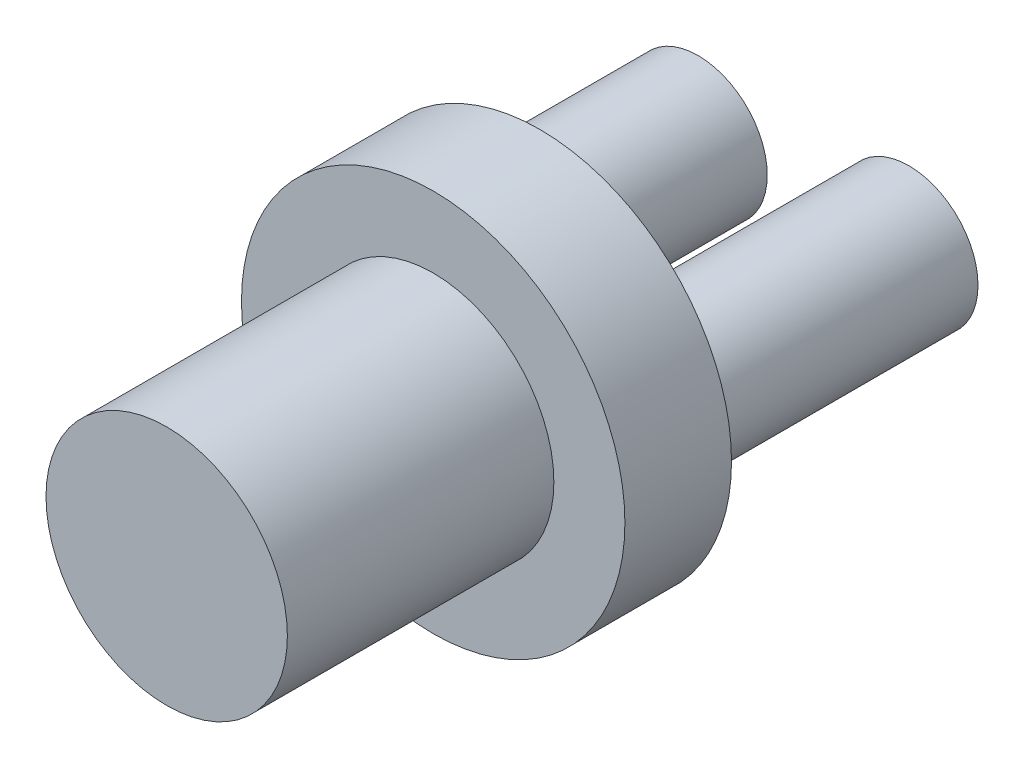
ISO-10303-21;
HEADER;
FILE_DESCRIPTION(('STEP AP214'),'2;1');
FILE_NAME('part.step','',(''),(''),'','','');
FILE_SCHEMA(('AUTOMOTIVE_DESIGN { 1 0 10303 214 1 1 1 1 }'));
ENDSEC;
DATA;
#1=APPLICATION_CONTEXT('core data for automotive mechanical design processes');
#2=APPLICATION_PROTOCOL_DEFINITION('international standard','automotive_design',2000,#1);
#3=PRODUCT_CONTEXT('',#1,'mechanical');
#4=PRODUCT('Part','Part','',(#3));
#5=PRODUCT_RELATED_PRODUCT_CATEGORY('part','',(#4));
#6=PRODUCT_DEFINITION_FORMATION('','',#4);
#7=PRODUCT_DEFINITION_CONTEXT('part definition',#1,'design');
#8=PRODUCT_DEFINITION('design','',#6,#7);
#9=PRODUCT_DEFINITION_SHAPE('','',#8);
#10=(LENGTH_UNIT() NAMED_UNIT(*) SI_UNIT(.MILLI.,.METRE.));
#11=(NAMED_UNIT(*) PLANE_ANGLE_UNIT() SI_UNIT($,.RADIAN.));
#12=(NAMED_UNIT(*) SI_UNIT($,.STERADIAN.) SOLID_ANGLE_UNIT());
#13=UNCERTAINTY_MEASURE_WITH_UNIT(LENGTH_MEASURE(1.E-05),#10,'distance_accuracy_value','');
#14=(GEOMETRIC_REPRESENTATION_CONTEXT(3) GLOBAL_UNCERTAINTY_ASSIGNED_CONTEXT((#13)) GLOBAL_UNIT_ASSIGNED_CONTEXT((#10,
#11,#12)) REPRESENTATION_CONTEXT('',''));
#15=CARTESIAN_POINT('',(0.,0.,0.));
#16=DIRECTION('',(0.,0.,1.));
#17=DIRECTION('',(1.,0.,0.));
#18=AXIS2_PLACEMENT_3D('',#15,#16,#17);
#19=CARTESIAN_POINT('',(0.,0.,20.));
#20=DIRECTION('',(0.,0.,-1.));
#21=DIRECTION('',(-1.,0.,0.));
#22=AXIS2_PLACEMENT_3D('',#19,#20,#21);
#23=CYLINDRICAL_SURFACE('',#22,35.97);
#24=CARTESIAN_POINT('',(0.,0.,20.));
#25=DIRECTION('',(0.,0.,1.));
#26=DIRECTION('',(1.,0.,0.));
#27=AXIS2_PLACEMENT_3D('',#24,#25,#26);
#28=CIRCLE('',#27,35.97);
#29=CARTESIAN_POINT('',(35.97,0.,20.));
#30=VERTEX_POINT('',#29);
#31=EDGE_CURVE('E44',#30,#30,#28,.T.);
#32=ORIENTED_EDGE('',*,*,#31,.F.);
#33=EDGE_LOOP('',(#32));
#34=FACE_BOUND('',#33,.T.);
#35=CARTESIAN_POINT('',(0.,0.,0.));
#36=DIRECTION('',(0.,0.,1.));
#37=DIRECTION('',(1.,0.,0.));
#38=AXIS2_PLACEMENT_3D('',#35,#36,#37);
#39=CIRCLE('',#38,35.97);
#40=CARTESIAN_POINT('',(35.97,0.,0.));
#41=VERTEX_POINT('',#40);
#42=EDGE_CURVE('E48',#41,#41,#39,.T.);
#43=ORIENTED_EDGE('',*,*,#42,.T.);
#44=EDGE_LOOP('',(#43));
#45=FACE_BOUND('',#44,.T.);
#46=ADVANCED_FACE('F34',(#34,#45),#23,.T.);
#47=CARTESIAN_POINT('',(0.,0.,20.));
#48=DIRECTION('',(0.,0.,1.));
#49=DIRECTION('',(1.,0.,0.));
#50=AXIS2_PLACEMENT_3D('',#47,#48,#49);
#51=PLANE('',#50);
#52=CARTESIAN_POINT('',(0.,0.,20.));
#53=DIRECTION('',(0.,0.,1.));
#54=DIRECTION('',(1.,0.,0.));
#55=AXIS2_PLACEMENT_3D('',#52,#53,#54);
#56=CIRCLE('',#55,22.6427431978425);
#57=CARTESIAN_POINT('',(22.6427431978425,0.,20.));
#58=VERTEX_POINT('',#57);
#59=EDGE_CURVE('E69',#58,#58,#56,.F.);
#60=ORIENTED_EDGE('',*,*,#59,.T.);
#61=EDGE_LOOP('',(#60));
#62=FACE_BOUND('',#61,.T.);
#63=ORIENTED_EDGE('',*,*,#31,.T.);
#64=EDGE_LOOP('',(#63));
#65=FACE_BOUND('',#64,.T.);
#66=ADVANCED_FACE('F95',(#62,#65),#51,.T.);
#67=CARTESIAN_POINT('',(0.,0.,0.));
#68=DIRECTION('',(0.,0.,1.));
#69=DIRECTION('',(1.,0.,0.));
#70=AXIS2_PLACEMENT_3D('',#67,#68,#69);
#71=PLANE('',#70);
#72=CARTESIAN_POINT('',(-20.2761617874865,-0.124861403939303,0.));
#73=DIRECTION('',(0.,0.,1.));
#74=DIRECTION('',(1.,0.,0.));
#75=AXIS2_PLACEMENT_3D('',#72,#73,#74);
#76=CIRCLE('',#75,12.95);
#77=CARTESIAN_POINT('',(-7.32616178748648,-0.124861403939303,0.));
#78=VERTEX_POINT('',#77);
#79=EDGE_CURVE('E10',#78,#78,#76,.F.);
#80=ORIENTED_EDGE('',*,*,#79,.F.);
#81=EDGE_LOOP('',(#80));
#82=FACE_BOUND('',#81,.T.);
#83=CARTESIAN_POINT('',(19.2685622101472,1.74925223466937,0.));
#84=DIRECTION('',(0.,0.,1.));
#85=DIRECTION('',(1.,0.,0.));
#86=AXIS2_PLACEMENT_3D('',#83,#84,#85);
#87=CIRCLE('',#86,12.9482187117196);
#88=CARTESIAN_POINT('',(32.2167809218668,1.74925223466937,0.));
#89=VERTEX_POINT('',#88);
#90=EDGE_CURVE('E40',#89,#89,#87,.F.);
#91=ORIENTED_EDGE('',*,*,#90,.F.);
#92=EDGE_LOOP('',(#91));
#93=FACE_BOUND('',#92,.T.);
#94=ORIENTED_EDGE('',*,*,#42,.F.);
#95=EDGE_LOOP('',(#94));
#96=FACE_BOUND('',#95,.T.);
#97=ADVANCED_FACE('F100',(#82,#93,#96),#71,.F.);
#98=CARTESIAN_POINT('',(19.2685622101472,1.74925223466937,-50.));
#99=DIRECTION('',(0.,0.,1.));
#100=DIRECTION('',(1.,0.,0.));
#101=AXIS2_PLACEMENT_3D('',#98,#99,#100);
#102=CYLINDRICAL_SURFACE('',#101,12.9482187117196);
#103=CARTESIAN_POINT('',(19.2685622101472,1.74925223466937,-50.));
#104=DIRECTION('',(0.,0.,-1.));
#105=DIRECTION('',(-1.,0.,0.));
#106=AXIS2_PLACEMENT_3D('',#103,#104,#105);
#107=CIRCLE('',#106,12.9482187117196);
#108=CARTESIAN_POINT('',(6.32034349842757,1.74925223466937,-50.));
#109=VERTEX_POINT('',#108);
#110=EDGE_CURVE('E52',#109,#109,#107,.T.);
#111=ORIENTED_EDGE('',*,*,#110,.F.);
#112=EDGE_LOOP('',(#111));
#113=FACE_BOUND('',#112,.T.);
#114=ORIENTED_EDGE('',*,*,#90,.T.);
#115=EDGE_LOOP('',(#114));
#116=FACE_BOUND('',#115,.T.);
#117=ADVANCED_FACE('F108',(#113,#116),#102,.T.);
#118=CARTESIAN_POINT('',(19.2685622101472,1.74925223466937,-50.));
#119=DIRECTION('',(0.,0.,-1.));
#120=DIRECTION('',(-1.,0.,0.));
#121=AXIS2_PLACEMENT_3D('',#118,#119,#120);
#122=PLANE('',#121);
#123=CARTESIAN_POINT('',(19.7906679893982,1.99417037415141,-50.));
#124=DIRECTION('',(0.,0.,-1.));
#125=DIRECTION('',(-1.,0.,0.));
#126=AXIS2_PLACEMENT_3D('',#123,#124,#125);
#127=CIRCLE('',#126,10.);
#128=CARTESIAN_POINT('',(9.79066798939817,1.99417037415141,-50.));
#129=VERTEX_POINT('',#128);
#130=EDGE_CURVE('E66',#129,#129,#127,.T.);
#131=ORIENTED_EDGE('',*,*,#130,.F.);
#132=EDGE_LOOP('',(#131));
#133=FACE_BOUND('',#132,.T.);
#134=ORIENTED_EDGE('',*,*,#110,.T.);
#135=EDGE_LOOP('',(#134));
#136=FACE_BOUND('',#135,.T.);
#137=ADVANCED_FACE('F113',(#133,#136),#122,.T.);
#138=CARTESIAN_POINT('',(-20.2761617874865,-0.124861403939303,-50.));
#139=DIRECTION('',(0.,0.,1.));
#140=DIRECTION('',(1.,0.,0.));
#141=AXIS2_PLACEMENT_3D('',#138,#139,#140);
#142=CYLINDRICAL_SURFACE('',#141,12.95);
#143=CARTESIAN_POINT('',(-20.2761617874865,-0.124861403939303,-50.));
#144=DIRECTION('',(0.,0.,-1.));
#145=DIRECTION('',(-1.,0.,0.));
#146=AXIS2_PLACEMENT_3D('',#143,#144,#145);
#147=CIRCLE('',#146,12.95);
#148=CARTESIAN_POINT('',(-33.2261617874865,-0.124861403939303,-50.));
#149=VERTEX_POINT('',#148);
#150=EDGE_CURVE('E56',#149,#149,#147,.T.);
#151=ORIENTED_EDGE('',*,*,#150,.F.);
#152=EDGE_LOOP('',(#151));
#153=FACE_BOUND('',#152,.T.);
#154=ORIENTED_EDGE('',*,*,#79,.T.);
#155=EDGE_LOOP('',(#154));
#156=FACE_BOUND('',#155,.T.);
#157=ADVANCED_FACE('F120',(#153,#156),#142,.T.);
#158=CARTESIAN_POINT('',(-20.2761617874865,-0.124861403939303,-50.));
#159=DIRECTION('',(0.,0.,-1.));
#160=DIRECTION('',(-1.,0.,0.));
#161=AXIS2_PLACEMENT_3D('',#158,#159,#160);
#162=PLANE('',#161);
#163=CARTESIAN_POINT('',(-19.5708283623343,0.225959526325746,-50.));
#164=DIRECTION('',(0.,0.,-1.));
#165=DIRECTION('',(-1.,0.,0.));
#166=AXIS2_PLACEMENT_3D('',#163,#164,#165);
#167=CIRCLE('',#166,10.);
#168=CARTESIAN_POINT('',(-29.5708283623343,0.225959526325746,-50.));
#169=VERTEX_POINT('',#168);
#170=EDGE_CURVE('E60',#169,#169,#167,.T.);
#171=ORIENTED_EDGE('',*,*,#170,.F.);
#172=EDGE_LOOP('',(#171));
#173=FACE_BOUND('',#172,.T.);
#174=ORIENTED_EDGE('',*,*,#150,.T.);
#175=EDGE_LOOP('',(#174));
#176=FACE_BOUND('',#175,.T.);
#177=ADVANCED_FACE('F124',(#173,#176),#162,.T.);
#178=CARTESIAN_POINT('',(-19.5708283623343,0.225959526325746,-30.));
#179=DIRECTION('',(0.,0.,-1.));
#180=DIRECTION('',(-1.,0.,0.));
#181=AXIS2_PLACEMENT_3D('',#178,#179,#180);
#182=CYLINDRICAL_SURFACE('',#181,10.);
#183=CARTESIAN_POINT('',(-19.5708283623343,0.225959526325746,-30.));
#184=DIRECTION('',(0.,0.,-1.));
#185=DIRECTION('',(-1.,0.,0.));
#186=AXIS2_PLACEMENT_3D('',#183,#184,#185);
#187=CIRCLE('',#186,10.);
#188=CARTESIAN_POINT('',(-29.5708283623343,0.225959526325746,-30.));
#189=VERTEX_POINT('',#188);
#190=EDGE_CURVE('E59',#189,#189,#187,.T.);
#191=ORIENTED_EDGE('',*,*,#190,.F.);
#192=EDGE_LOOP('',(#191));
#193=FACE_BOUND('',#192,.T.);
#194=ORIENTED_EDGE('',*,*,#170,.T.);
#195=EDGE_LOOP('',(#194));
#196=FACE_BOUND('',#195,.T.);
#197=ADVANCED_FACE('F128',(#193,#196),#182,.F.);
#198=CARTESIAN_POINT('',(-19.5708283623343,0.225959526325746,-30.));
#199=DIRECTION('',(0.,0.,-1.));
#200=DIRECTION('',(-1.,0.,0.));
#201=AXIS2_PLACEMENT_3D('',#198,#199,#200);
#202=PLANE('',#201);
#203=ORIENTED_EDGE('',*,*,#190,.T.);
#204=EDGE_LOOP('',(#203));
#205=FACE_BOUND('',#204,.T.);
#206=ADVANCED_FACE('F132',(#205),#202,.T.);
#207=CARTESIAN_POINT('',(19.7906679893982,1.99417037415141,-30.));
#208=DIRECTION('',(0.,0.,-1.));
#209=DIRECTION('',(-1.,0.,0.));
#210=AXIS2_PLACEMENT_3D('',#207,#208,#209);
#211=CYLINDRICAL_SURFACE('',#210,10.);
#212=CARTESIAN_POINT('',(19.7906679893982,1.99417037415141,-30.));
#213=DIRECTION('',(0.,0.,-1.));
#214=DIRECTION('',(-1.,0.,0.));
#215=AXIS2_PLACEMENT_3D('',#212,#213,#214);
#216=CIRCLE('',#215,10.);
#217=CARTESIAN_POINT('',(9.79066798939817,1.99417037415141,-30.));
#218=VERTEX_POINT('',#217);
#219=EDGE_CURVE('E63',#218,#218,#216,.T.);
#220=ORIENTED_EDGE('',*,*,#219,.F.);
#221=EDGE_LOOP('',(#220));
#222=FACE_BOUND('',#221,.T.);
#223=ORIENTED_EDGE('',*,*,#130,.T.);
#224=EDGE_LOOP('',(#223));
#225=FACE_BOUND('',#224,.T.);
#226=ADVANCED_FACE('F90',(#222,#225),#211,.F.);
#227=CARTESIAN_POINT('',(19.7906679893982,1.99417037415141,-30.));
#228=DIRECTION('',(0.,0.,-1.));
#229=DIRECTION('',(-1.,0.,0.));
#230=AXIS2_PLACEMENT_3D('',#227,#228,#229);
#231=PLANE('',#230);
#232=ORIENTED_EDGE('',*,*,#219,.T.);
#233=EDGE_LOOP('',(#232));
#234=FACE_BOUND('',#233,.T.);
#235=ADVANCED_FACE('F82',(#234),#231,.T.);
#236=CARTESIAN_POINT('',(0.,0.,70.));
#237=DIRECTION('',(0.,0.,-1.));
#238=DIRECTION('',(-1.,0.,0.));
#239=AXIS2_PLACEMENT_3D('',#236,#237,#238);
#240=CYLINDRICAL_SURFACE('',#239,22.6427431978425);
#241=ORIENTED_EDGE('',*,*,#59,.F.);
#242=EDGE_LOOP('',(#241));
#243=FACE_BOUND('',#242,.T.);
#244=CARTESIAN_POINT('',(0.,0.,70.));
#245=DIRECTION('',(0.,0.,1.));
#246=DIRECTION('',(1.,0.,0.));
#247=AXIS2_PLACEMENT_3D('',#244,#245,#246);
#248=CIRCLE('',#247,22.6427431978425);
#249=CARTESIAN_POINT('',(22.6427431978425,0.,70.));
#250=VERTEX_POINT('',#249);
#251=EDGE_CURVE('E74',#250,#250,#248,.T.);
#252=ORIENTED_EDGE('',*,*,#251,.F.);
#253=EDGE_LOOP('',(#252));
#254=FACE_BOUND('',#253,.T.);
#255=ADVANCED_FACE('F80',(#243,#254),#240,.T.);
#256=CARTESIAN_POINT('',(0.,0.,70.));
#257=DIRECTION('',(0.,0.,1.));
#258=DIRECTION('',(1.,0.,0.));
#259=AXIS2_PLACEMENT_3D('',#256,#257,#258);
#260=PLANE('',#259);
#261=ORIENTED_EDGE('',*,*,#251,.T.);
#262=EDGE_LOOP('',(#261));
#263=FACE_BOUND('',#262,.T.);
#264=ADVANCED_FACE('F78',(#263),#260,.T.);
#265=CLOSED_SHELL('',(#46,#66,#97,#117,#137,#157,#177,#197,#206,#226,#235,#255,#264));
#266=MANIFOLD_SOLID_BREP('B2',#265);
#267=ADVANCED_BREP_SHAPE_REPRESENTATION('',(#18,#266),#14);
#268=SHAPE_DEFINITION_REPRESENTATION(#9,#267);
ENDSEC;
END-ISO-10303-21;
